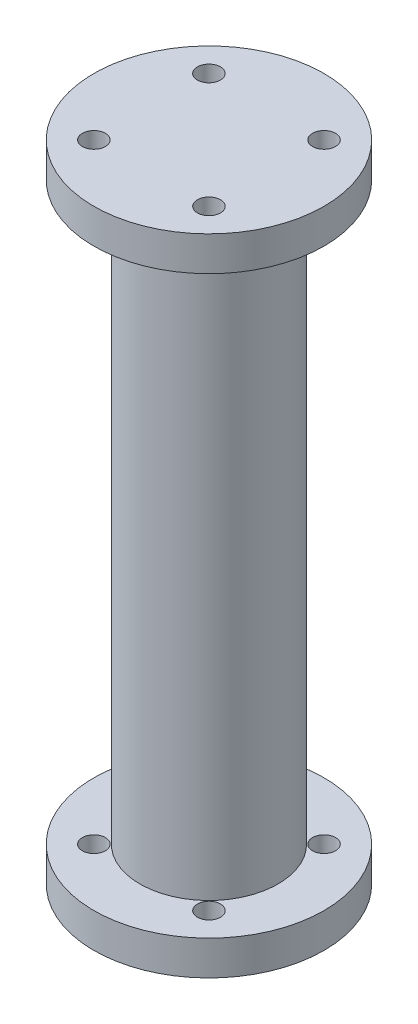
ISO-10303-21;
HEADER;
FILE_DESCRIPTION(('STEP AP214'),'2;1');
FILE_NAME('part.step','',(''),(''),'','','');
FILE_SCHEMA(('AUTOMOTIVE_DESIGN { 1 0 10303 214 1 1 1 1 }'));
ENDSEC;
DATA;
#1=APPLICATION_CONTEXT('core data for automotive mechanical design processes');
#2=APPLICATION_PROTOCOL_DEFINITION('international standard','automotive_design',2000,#1);
#3=PRODUCT_CONTEXT('',#1,'mechanical');
#4=PRODUCT('Part','Part','',(#3));
#5=PRODUCT_RELATED_PRODUCT_CATEGORY('part','',(#4));
#6=PRODUCT_DEFINITION_FORMATION('','',#4);
#7=PRODUCT_DEFINITION_CONTEXT('part definition',#1,'design');
#8=PRODUCT_DEFINITION('design','',#6,#7);
#9=PRODUCT_DEFINITION_SHAPE('','',#8);
#10=(LENGTH_UNIT() NAMED_UNIT(*) SI_UNIT(.MILLI.,.METRE.));
#11=(NAMED_UNIT(*) PLANE_ANGLE_UNIT() SI_UNIT($,.RADIAN.));
#12=(NAMED_UNIT(*) SI_UNIT($,.STERADIAN.) SOLID_ANGLE_UNIT());
#13=UNCERTAINTY_MEASURE_WITH_UNIT(LENGTH_MEASURE(1.E-05),#10,'distance_accuracy_value','');
#14=(GEOMETRIC_REPRESENTATION_CONTEXT(3) GLOBAL_UNCERTAINTY_ASSIGNED_CONTEXT((#13)) GLOBAL_UNIT_ASSIGNED_CONTEXT((#10,
#11,#12)) REPRESENTATION_CONTEXT('',''));
#15=CARTESIAN_POINT('',(0.,0.,0.));
#16=DIRECTION('',(0.,0.,1.));
#17=DIRECTION('',(1.,0.,0.));
#18=AXIS2_PLACEMENT_3D('',#15,#16,#17);
#19=CARTESIAN_POINT('',(0.,25.,0.));
#20=DIRECTION('',(0.,1.,0.));
#21=DIRECTION('',(-1.,0.,0.));
#22=AXIS2_PLACEMENT_3D('',#19,#20,#21);
#23=CYLINDRICAL_SURFACE('',#22,6.);
#24=CARTESIAN_POINT('',(0.,25.,0.));
#25=DIRECTION('',(0.,1.,0.));
#26=DIRECTION('',(-1.,0.,0.));
#27=AXIS2_PLACEMENT_3D('',#24,#25,#26);
#28=CIRCLE('',#27,6.);
#29=CARTESIAN_POINT('',(-6.,25.,0.));
#30=VERTEX_POINT('',#29);
#31=EDGE_CURVE('E10',#30,#30,#28,.T.);
#32=ORIENTED_EDGE('',*,*,#31,.F.);
#33=EDGE_LOOP('',(#32));
#34=FACE_BOUND('',#33,.T.);
#35=CARTESIAN_POINT('',(0.,-25.,0.));
#36=DIRECTION('',(0.,1.,0.));
#37=DIRECTION('',(-1.,0.,0.));
#38=AXIS2_PLACEMENT_3D('',#35,#36,#37);
#39=CIRCLE('',#38,6.);
#40=CARTESIAN_POINT('',(-6.,-25.,0.));
#41=VERTEX_POINT('',#40);
#42=EDGE_CURVE('E48',#41,#41,#39,.T.);
#43=ORIENTED_EDGE('',*,*,#42,.T.);
#44=EDGE_LOOP('',(#43));
#45=FACE_BOUND('',#44,.T.);
#46=ADVANCED_FACE('F32',(#34,#45),#23,.T.);
#47=CARTESIAN_POINT('',(0.,28.,0.));
#48=DIRECTION('',(0.,1.,0.));
#49=DIRECTION('',(-1.,0.,0.));
#50=AXIS2_PLACEMENT_3D('',#47,#48,#49);
#51=PLANE('',#50);
#52=CARTESIAN_POINT('',(5.00000000000002,28.,-5.));
#53=DIRECTION('',(0.,1.,0.));
#54=DIRECTION('',(-1.,0.,0.));
#55=AXIS2_PLACEMENT_3D('',#52,#53,#54);
#56=CIRCLE('',#55,1.);
#57=CARTESIAN_POINT('',(4.00000000000002,28.,-5.));
#58=VERTEX_POINT('',#57);
#59=EDGE_CURVE('E157',#58,#58,#56,.T.);
#60=ORIENTED_EDGE('',*,*,#59,.F.);
#61=EDGE_LOOP('',(#60));
#62=FACE_BOUND('',#61,.T.);
#63=CARTESIAN_POINT('',(-4.99999999999997,28.,5.));
#64=DIRECTION('',(0.,1.,0.));
#65=DIRECTION('',(-1.,0.,0.));
#66=AXIS2_PLACEMENT_3D('',#63,#64,#65);
#67=CIRCLE('',#66,1.);
#68=CARTESIAN_POINT('',(-5.99999999999997,28.,5.));
#69=VERTEX_POINT('',#68);
#70=EDGE_CURVE('E158',#69,#69,#67,.T.);
#71=ORIENTED_EDGE('',*,*,#70,.F.);
#72=EDGE_LOOP('',(#71));
#73=FACE_BOUND('',#72,.T.);
#74=CARTESIAN_POINT('',(5.00000000000003,28.,5.));
#75=DIRECTION('',(0.,1.,0.));
#76=DIRECTION('',(-1.,0.,0.));
#77=AXIS2_PLACEMENT_3D('',#74,#75,#76);
#78=CIRCLE('',#77,1.);
#79=CARTESIAN_POINT('',(4.00000000000003,28.,5.));
#80=VERTEX_POINT('',#79);
#81=EDGE_CURVE('E161',#80,#80,#78,.T.);
#82=ORIENTED_EDGE('',*,*,#81,.F.);
#83=EDGE_LOOP('',(#82));
#84=FACE_BOUND('',#83,.T.);
#85=CARTESIAN_POINT('',(-4.99999999999998,28.,-5.));
#86=DIRECTION('',(0.,1.,0.));
#87=DIRECTION('',(-1.,0.,0.));
#88=AXIS2_PLACEMENT_3D('',#85,#86,#87);
#89=CIRCLE('',#88,1.);
#90=CARTESIAN_POINT('',(-5.99999999999998,28.,-5.));
#91=VERTEX_POINT('',#90);
#92=EDGE_CURVE('E53',#91,#91,#89,.T.);
#93=ORIENTED_EDGE('',*,*,#92,.F.);
#94=EDGE_LOOP('',(#93));
#95=FACE_BOUND('',#94,.T.);
#96=CARTESIAN_POINT('',(0.,28.,0.));
#97=DIRECTION('',(0.,-1.,0.));
#98=DIRECTION('',(1.,0.,0.));
#99=AXIS2_PLACEMENT_3D('',#96,#97,#98);
#100=CIRCLE('',#99,10.);
#101=CARTESIAN_POINT('',(10.,28.,0.));
#102=VERTEX_POINT('',#101);
#103=EDGE_CURVE('E39',#102,#102,#100,.T.);
#104=ORIENTED_EDGE('',*,*,#103,.F.);
#105=EDGE_LOOP('',(#104));
#106=FACE_BOUND('',#105,.T.);
#107=ADVANCED_FACE('F125',(#62,#73,#84,#95,#106),#51,.T.);
#108=CARTESIAN_POINT('',(0.,25.,0.));
#109=DIRECTION('',(0.,-1.,0.));
#110=DIRECTION('',(1.,0.,0.));
#111=AXIS2_PLACEMENT_3D('',#108,#109,#110);
#112=CYLINDRICAL_SURFACE('',#111,10.);
#113=ORIENTED_EDGE('',*,*,#103,.T.);
#114=EDGE_LOOP('',(#113));
#115=FACE_BOUND('',#114,.T.);
#116=CARTESIAN_POINT('',(0.,25.,0.));
#117=DIRECTION('',(0.,-1.,0.));
#118=DIRECTION('',(1.,0.,0.));
#119=AXIS2_PLACEMENT_3D('',#116,#117,#118);
#120=CIRCLE('',#119,10.);
#121=CARTESIAN_POINT('',(10.,25.,0.));
#122=VERTEX_POINT('',#121);
#123=EDGE_CURVE('E44',#122,#122,#120,.T.);
#124=ORIENTED_EDGE('',*,*,#123,.F.);
#125=EDGE_LOOP('',(#124));
#126=FACE_BOUND('',#125,.T.);
#127=ADVANCED_FACE('F130',(#115,#126),#112,.T.);
#128=CARTESIAN_POINT('',(0.,25.,0.));
#129=DIRECTION('',(0.,-1.,0.));
#130=DIRECTION('',(1.,0.,0.));
#131=AXIS2_PLACEMENT_3D('',#128,#129,#130);
#132=PLANE('',#131);
#133=CARTESIAN_POINT('',(5.00000000000002,25.0000000000004,-5.));
#134=DIRECTION('',(0.,-1.,0.));
#135=DIRECTION('',(1.,0.,0.));
#136=AXIS2_PLACEMENT_3D('',#133,#134,#135);
#137=CIRCLE('',#136,1.);
#138=CARTESIAN_POINT('',(6.00000000000002,25.0000000000004,-5.));
#139=VERTEX_POINT('',#138);
#140=EDGE_CURVE('E80',#139,#139,#137,.T.);
#141=ORIENTED_EDGE('',*,*,#140,.F.);
#142=EDGE_LOOP('',(#141));
#143=FACE_BOUND('',#142,.T.);
#144=CARTESIAN_POINT('',(-4.99999999999998,25.0000000000004,5.));
#145=DIRECTION('',(0.,-1.,0.));
#146=DIRECTION('',(1.,0.,0.));
#147=AXIS2_PLACEMENT_3D('',#144,#145,#146);
#148=CIRCLE('',#147,1.);
#149=CARTESIAN_POINT('',(-3.99999999999998,25.0000000000004,5.));
#150=VERTEX_POINT('',#149);
#151=EDGE_CURVE('E65',#150,#150,#148,.T.);
#152=ORIENTED_EDGE('',*,*,#151,.F.);
#153=EDGE_LOOP('',(#152));
#154=FACE_BOUND('',#153,.T.);
#155=CARTESIAN_POINT('',(5.00000000000002,25.0000000000004,5.));
#156=DIRECTION('',(0.,-1.,0.));
#157=DIRECTION('',(1.,0.,0.));
#158=AXIS2_PLACEMENT_3D('',#155,#156,#157);
#159=CIRCLE('',#158,1.);
#160=CARTESIAN_POINT('',(6.00000000000002,25.0000000000004,5.));
#161=VERTEX_POINT('',#160);
#162=EDGE_CURVE('E61',#161,#161,#159,.T.);
#163=ORIENTED_EDGE('',*,*,#162,.F.);
#164=EDGE_LOOP('',(#163));
#165=FACE_BOUND('',#164,.T.);
#166=CARTESIAN_POINT('',(-4.99999999999998,25.0000000000004,-5.));
#167=DIRECTION('',(0.,-1.,0.));
#168=DIRECTION('',(1.,0.,0.));
#169=AXIS2_PLACEMENT_3D('',#166,#167,#168);
#170=CIRCLE('',#169,1.);
#171=CARTESIAN_POINT('',(-3.99999999999998,25.0000000000004,-5.));
#172=VERTEX_POINT('',#171);
#173=EDGE_CURVE('E57',#172,#172,#170,.T.);
#174=ORIENTED_EDGE('',*,*,#173,.F.);
#175=EDGE_LOOP('',(#174));
#176=FACE_BOUND('',#175,.T.);
#177=ORIENTED_EDGE('',*,*,#31,.T.);
#178=EDGE_LOOP('',(#177));
#179=FACE_BOUND('',#178,.T.);
#180=ORIENTED_EDGE('',*,*,#123,.T.);
#181=EDGE_LOOP('',(#180));
#182=FACE_BOUND('',#181,.T.);
#183=ADVANCED_FACE('F100',(#143,#154,#165,#176,#179,#182),#132,.T.);
#184=CARTESIAN_POINT('',(0.,-25.,0.));
#185=DIRECTION('',(0.,1.,0.));
#186=DIRECTION('',(-1.,0.,0.));
#187=AXIS2_PLACEMENT_3D('',#184,#185,#186);
#188=PLANE('',#187);
#189=CARTESIAN_POINT('',(4.99999999999998,-25.0000000000004,-5.));
#190=DIRECTION('',(0.,1.,0.));
#191=DIRECTION('',(-1.,0.,0.));
#192=AXIS2_PLACEMENT_3D('',#189,#190,#191);
#193=CIRCLE('',#192,1.);
#194=CARTESIAN_POINT('',(3.99999999999998,-25.0000000000004,-5.));
#195=VERTEX_POINT('',#194);
#196=EDGE_CURVE('E77',#195,#195,#193,.T.);
#197=ORIENTED_EDGE('',*,*,#196,.F.);
#198=EDGE_LOOP('',(#197));
#199=FACE_BOUND('',#198,.T.);
#200=CARTESIAN_POINT('',(-5.00000000000002,-25.0000000000004,5.));
#201=DIRECTION('',(0.,1.,0.));
#202=DIRECTION('',(-1.,0.,0.));
#203=AXIS2_PLACEMENT_3D('',#200,#201,#202);
#204=CIRCLE('',#203,1.);
#205=CARTESIAN_POINT('',(-6.00000000000002,-25.0000000000004,5.));
#206=VERTEX_POINT('',#205);
#207=EDGE_CURVE('E60',#206,#206,#204,.T.);
#208=ORIENTED_EDGE('',*,*,#207,.F.);
#209=EDGE_LOOP('',(#208));
#210=FACE_BOUND('',#209,.T.);
#211=CARTESIAN_POINT('',(4.99999999999998,-25.0000000000004,5.));
#212=DIRECTION('',(0.,1.,0.));
#213=DIRECTION('',(-1.,0.,0.));
#214=AXIS2_PLACEMENT_3D('',#211,#212,#213);
#215=CIRCLE('',#214,1.);
#216=CARTESIAN_POINT('',(3.99999999999998,-25.0000000000004,5.));
#217=VERTEX_POINT('',#216);
#218=EDGE_CURVE('E56',#217,#217,#215,.T.);
#219=ORIENTED_EDGE('',*,*,#218,.F.);
#220=EDGE_LOOP('',(#219));
#221=FACE_BOUND('',#220,.T.);
#222=CARTESIAN_POINT('',(-5.00000000000002,-25.0000000000004,-5.));
#223=DIRECTION('',(0.,1.,0.));
#224=DIRECTION('',(-1.,0.,0.));
#225=AXIS2_PLACEMENT_3D('',#222,#223,#224);
#226=CIRCLE('',#225,1.);
#227=CARTESIAN_POINT('',(-6.00000000000002,-25.0000000000004,-5.));
#228=VERTEX_POINT('',#227);
#229=EDGE_CURVE('E52',#228,#228,#226,.T.);
#230=ORIENTED_EDGE('',*,*,#229,.F.);
#231=EDGE_LOOP('',(#230));
#232=FACE_BOUND('',#231,.T.);
#233=ORIENTED_EDGE('',*,*,#42,.F.);
#234=EDGE_LOOP('',(#233));
#235=FACE_BOUND('',#234,.T.);
#236=CARTESIAN_POINT('',(0.,-25.,0.));
#237=DIRECTION('',(0.,-1.,0.));
#238=DIRECTION('',(1.,0.,0.));
#239=AXIS2_PLACEMENT_3D('',#236,#237,#238);
#240=CIRCLE('',#239,10.);
#241=CARTESIAN_POINT('',(10.,-25.,0.));
#242=VERTEX_POINT('',#241);
#243=EDGE_CURVE('E86',#242,#242,#240,.T.);
#244=ORIENTED_EDGE('',*,*,#243,.F.);
#245=EDGE_LOOP('',(#244));
#246=FACE_BOUND('',#245,.T.);
#247=ADVANCED_FACE('F96',(#199,#210,#221,#232,#235,#246),#188,.T.);
#248=CARTESIAN_POINT('',(0.,25.,0.));
#249=DIRECTION('',(0.,-1.,0.));
#250=DIRECTION('',(1.,0.,0.));
#251=AXIS2_PLACEMENT_3D('',#248,#249,#250);
#252=CYLINDRICAL_SURFACE('',#251,10.);
#253=ORIENTED_EDGE('',*,*,#243,.T.);
#254=EDGE_LOOP('',(#253));
#255=FACE_BOUND('',#254,.T.);
#256=CARTESIAN_POINT('',(0.,-28.,0.));
#257=DIRECTION('',(0.,-1.,0.));
#258=DIRECTION('',(1.,0.,0.));
#259=AXIS2_PLACEMENT_3D('',#256,#257,#258);
#260=CIRCLE('',#259,10.);
#261=CARTESIAN_POINT('',(10.,-28.,0.));
#262=VERTEX_POINT('',#261);
#263=EDGE_CURVE('E83',#262,#262,#260,.T.);
#264=ORIENTED_EDGE('',*,*,#263,.F.);
#265=EDGE_LOOP('',(#264));
#266=FACE_BOUND('',#265,.T.);
#267=ADVANCED_FACE('F99',(#255,#266),#252,.T.);
#268=CARTESIAN_POINT('',(0.,-28.,0.));
#269=DIRECTION('',(0.,-1.,0.));
#270=DIRECTION('',(1.,0.,0.));
#271=AXIS2_PLACEMENT_3D('',#268,#269,#270);
#272=PLANE('',#271);
#273=CARTESIAN_POINT('',(4.99999999999998,-27.9999999999996,-5.));
#274=DIRECTION('',(0.,-1.,0.));
#275=DIRECTION('',(1.,0.,0.));
#276=AXIS2_PLACEMENT_3D('',#273,#274,#275);
#277=CIRCLE('',#276,1.);
#278=CARTESIAN_POINT('',(5.99999999999998,-27.9999999999996,-5.));
#279=VERTEX_POINT('',#278);
#280=EDGE_CURVE('E35',#279,#279,#277,.T.);
#281=ORIENTED_EDGE('',*,*,#280,.F.);
#282=EDGE_LOOP('',(#281));
#283=FACE_BOUND('',#282,.T.);
#284=CARTESIAN_POINT('',(-5.00000000000002,-27.9999999999996,5.));
#285=DIRECTION('',(0.,-1.,0.));
#286=DIRECTION('',(1.,0.,0.));
#287=AXIS2_PLACEMENT_3D('',#284,#285,#286);
#288=CIRCLE('',#287,1.);
#289=CARTESIAN_POINT('',(-4.00000000000002,-27.9999999999996,5.));
#290=VERTEX_POINT('',#289);
#291=EDGE_CURVE('E58',#290,#290,#288,.T.);
#292=ORIENTED_EDGE('',*,*,#291,.F.);
#293=EDGE_LOOP('',(#292));
#294=FACE_BOUND('',#293,.T.);
#295=CARTESIAN_POINT('',(4.99999999999998,-27.9999999999996,5.));
#296=DIRECTION('',(0.,-1.,0.));
#297=DIRECTION('',(1.,0.,0.));
#298=AXIS2_PLACEMENT_3D('',#295,#296,#297);
#299=CIRCLE('',#298,1.);
#300=CARTESIAN_POINT('',(5.99999999999998,-27.9999999999996,5.));
#301=VERTEX_POINT('',#300);
#302=EDGE_CURVE('E54',#301,#301,#299,.T.);
#303=ORIENTED_EDGE('',*,*,#302,.F.);
#304=EDGE_LOOP('',(#303));
#305=FACE_BOUND('',#304,.T.);
#306=CARTESIAN_POINT('',(-5.00000000000002,-27.9999999999996,-5.));
#307=DIRECTION('',(0.,-1.,0.));
#308=DIRECTION('',(1.,0.,0.));
#309=AXIS2_PLACEMENT_3D('',#306,#307,#308);
#310=CIRCLE('',#309,1.);
#311=CARTESIAN_POINT('',(-4.00000000000002,-27.9999999999996,-5.));
#312=VERTEX_POINT('',#311);
#313=EDGE_CURVE('E49',#312,#312,#310,.T.);
#314=ORIENTED_EDGE('',*,*,#313,.F.);
#315=EDGE_LOOP('',(#314));
#316=FACE_BOUND('',#315,.T.);
#317=ORIENTED_EDGE('',*,*,#263,.T.);
#318=EDGE_LOOP('',(#317));
#319=FACE_BOUND('',#318,.T.);
#320=ADVANCED_FACE('F107',(#283,#294,#305,#316,#319),#272,.T.);
#321=CARTESIAN_POINT('',(-5.00000000000431,-4972.,-5.));
#322=DIRECTION('',(0.,1.,0.));
#323=DIRECTION('',(-1.,0.,0.));
#324=AXIS2_PLACEMENT_3D('',#321,#322,#323);
#325=CYLINDRICAL_SURFACE('',#324,1.);
#326=ORIENTED_EDGE('',*,*,#229,.T.);
#327=EDGE_LOOP('',(#326));
#328=FACE_BOUND('',#327,.T.);
#329=ORIENTED_EDGE('',*,*,#313,.T.);
#330=EDGE_LOOP('',(#329));
#331=FACE_BOUND('',#330,.T.);
#332=ADVANCED_FACE('F112',(#328,#331),#325,.F.);
#333=CARTESIAN_POINT('',(4.99999999999569,-4972.,5.));
#334=DIRECTION('',(0.,1.,0.));
#335=DIRECTION('',(-1.,0.,0.));
#336=AXIS2_PLACEMENT_3D('',#333,#334,#335);
#337=CYLINDRICAL_SURFACE('',#336,1.);
#338=ORIENTED_EDGE('',*,*,#218,.T.);
#339=EDGE_LOOP('',(#338));
#340=FACE_BOUND('',#339,.T.);
#341=ORIENTED_EDGE('',*,*,#302,.T.);
#342=EDGE_LOOP('',(#341));
#343=FACE_BOUND('',#342,.T.);
#344=ADVANCED_FACE('F118',(#340,#343),#337,.F.);
#345=CARTESIAN_POINT('',(-5.00000000000431,-4972.,5.));
#346=DIRECTION('',(0.,1.,0.));
#347=DIRECTION('',(-1.,0.,0.));
#348=AXIS2_PLACEMENT_3D('',#345,#346,#347);
#349=CYLINDRICAL_SURFACE('',#348,1.);
#350=ORIENTED_EDGE('',*,*,#207,.T.);
#351=EDGE_LOOP('',(#350));
#352=FACE_BOUND('',#351,.T.);
#353=ORIENTED_EDGE('',*,*,#291,.T.);
#354=EDGE_LOOP('',(#353));
#355=FACE_BOUND('',#354,.T.);
#356=ADVANCED_FACE('F183',(#352,#355),#349,.F.);
#357=CARTESIAN_POINT('',(4.99999999999569,-4972.,-5.));
#358=DIRECTION('',(0.,1.,0.));
#359=DIRECTION('',(-1.,0.,0.));
#360=AXIS2_PLACEMENT_3D('',#357,#358,#359);
#361=CYLINDRICAL_SURFACE('',#360,1.);
#362=ORIENTED_EDGE('',*,*,#196,.T.);
#363=EDGE_LOOP('',(#362));
#364=FACE_BOUND('',#363,.T.);
#365=ORIENTED_EDGE('',*,*,#280,.T.);
#366=EDGE_LOOP('',(#365));
#367=FACE_BOUND('',#366,.T.);
#368=ADVANCED_FACE('F176',(#364,#367),#361,.F.);
#369=ORIENTED_EDGE('',*,*,#173,.T.);
#370=EDGE_LOOP('',(#369));
#371=FACE_BOUND('',#370,.T.);
#372=ORIENTED_EDGE('',*,*,#92,.T.);
#373=EDGE_LOOP('',(#372));
#374=FACE_BOUND('',#373,.T.);
#375=ADVANCED_FACE('F121',(#371,#374),#325,.F.);
#376=ORIENTED_EDGE('',*,*,#162,.T.);
#377=EDGE_LOOP('',(#376));
#378=FACE_BOUND('',#377,.T.);
#379=ORIENTED_EDGE('',*,*,#81,.T.);
#380=EDGE_LOOP('',(#379));
#381=FACE_BOUND('',#380,.T.);
#382=ADVANCED_FACE('F167',(#378,#381),#337,.F.);
#383=ORIENTED_EDGE('',*,*,#151,.T.);
#384=EDGE_LOOP('',(#383));
#385=FACE_BOUND('',#384,.T.);
#386=ORIENTED_EDGE('',*,*,#70,.T.);
#387=EDGE_LOOP('',(#386));
#388=FACE_BOUND('',#387,.T.);
#389=ADVANCED_FACE('F181',(#385,#388),#349,.F.);
#390=ORIENTED_EDGE('',*,*,#140,.T.);
#391=EDGE_LOOP('',(#390));
#392=FACE_BOUND('',#391,.T.);
#393=ORIENTED_EDGE('',*,*,#59,.T.);
#394=EDGE_LOOP('',(#393));
#395=FACE_BOUND('',#394,.T.);
#396=ADVANCED_FACE('F186',(#392,#395),#361,.F.);
#397=CLOSED_SHELL('',(#46,#107,#127,#183,#247,#267,#320,#332,#344,#356,#368,#375,#382,#389,#396));
#398=MANIFOLD_SOLID_BREP('B2',#397);
#399=ADVANCED_BREP_SHAPE_REPRESENTATION('',(#18,#398),#14);
#400=SHAPE_DEFINITION_REPRESENTATION(#9,#399);
ENDSEC;
END-ISO-10303-21;
